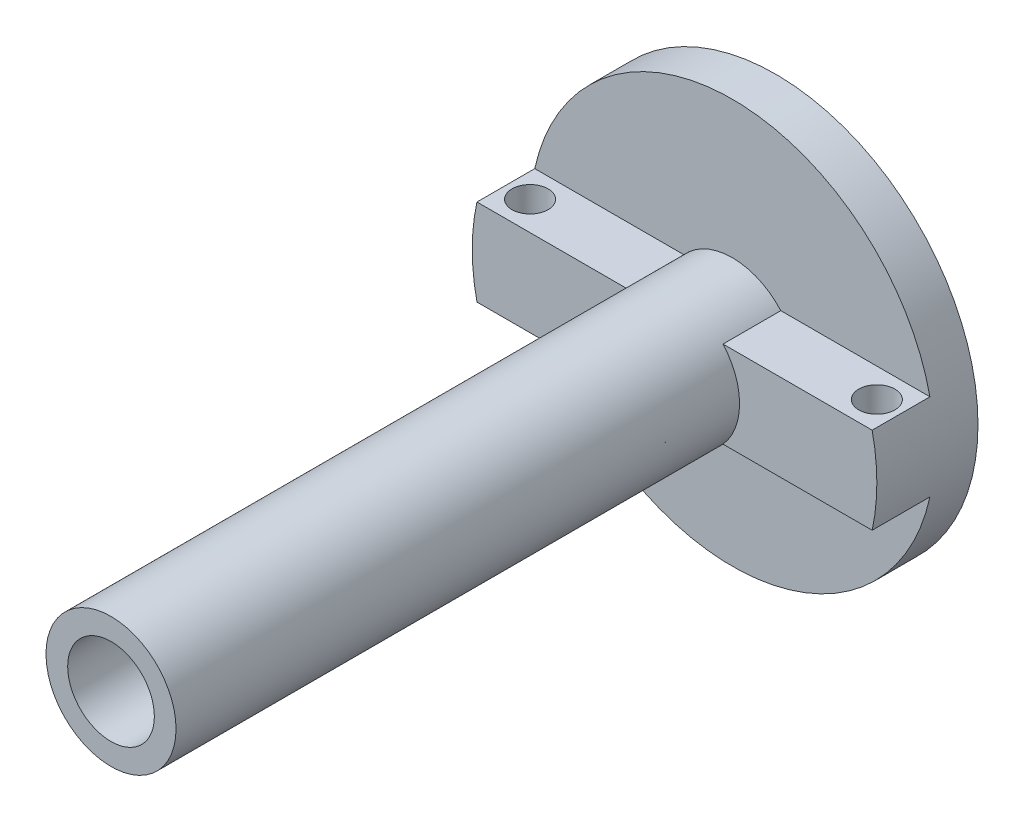
ISO-10303-21;
HEADER;
FILE_DESCRIPTION(('STEP AP214'),'2;1');
FILE_NAME('part.step','',(''),(''),'','','');
FILE_SCHEMA(('AUTOMOTIVE_DESIGN { 1 0 10303 214 1 1 1 1 }'));
ENDSEC;
DATA;
#1=APPLICATION_CONTEXT('core data for automotive mechanical design processes');
#2=APPLICATION_PROTOCOL_DEFINITION('international standard','automotive_design',2000,#1);
#3=PRODUCT_CONTEXT('',#1,'mechanical');
#4=PRODUCT('Part','Part','',(#3));
#5=PRODUCT_RELATED_PRODUCT_CATEGORY('part','',(#4));
#6=PRODUCT_DEFINITION_FORMATION('','',#4);
#7=PRODUCT_DEFINITION_CONTEXT('part definition',#1,'design');
#8=PRODUCT_DEFINITION('design','',#6,#7);
#9=PRODUCT_DEFINITION_SHAPE('','',#8);
#10=(LENGTH_UNIT() NAMED_UNIT(*) SI_UNIT(.MILLI.,.METRE.));
#11=(NAMED_UNIT(*) PLANE_ANGLE_UNIT() SI_UNIT($,.RADIAN.));
#12=(NAMED_UNIT(*) SI_UNIT($,.STERADIAN.) SOLID_ANGLE_UNIT());
#13=UNCERTAINTY_MEASURE_WITH_UNIT(LENGTH_MEASURE(1.E-05),#10,'distance_accuracy_value','');
#14=(GEOMETRIC_REPRESENTATION_CONTEXT(3) GLOBAL_UNCERTAINTY_ASSIGNED_CONTEXT((#13)) GLOBAL_UNIT_ASSIGNED_CONTEXT((#10,
#11,#12)) REPRESENTATION_CONTEXT('',''));
#15=CARTESIAN_POINT('',(0.,0.,0.));
#16=DIRECTION('',(0.,0.,1.));
#17=DIRECTION('',(1.,0.,0.));
#18=AXIS2_PLACEMENT_3D('',#15,#16,#17);
#19=CARTESIAN_POINT('',(0.,0.,1.5));
#20=DIRECTION('',(0.,0.,1.));
#21=DIRECTION('',(1.,0.,0.));
#22=AXIS2_PLACEMENT_3D('',#19,#20,#21);
#23=PLANE('',#22);
#24=CARTESIAN_POINT('',(0.,0.,1.5));
#25=DIRECTION('',(0.,0.,1.));
#26=DIRECTION('',(1.,0.,0.));
#27=AXIS2_PLACEMENT_3D('',#24,#25,#26);
#28=CIRCLE('',#27,7.);
#29=CARTESIAN_POINT('',(-6.83739716558867,-1.5,1.5));
#30=VERTEX_POINT('',#29);
#31=CARTESIAN_POINT('',(6.83739716558867,-1.5,1.5));
#32=VERTEX_POINT('',#31);
#33=EDGE_CURVE('E126',#30,#32,#28,.T.);
#34=ORIENTED_EDGE('',*,*,#33,.T.);
#35=DIRECTION('',(1.,0.,0.));
#36=VECTOR('',#35,1.);
#37=CARTESIAN_POINT('',(6.83739716558867,-1.5,1.5));
#38=LINE('',#37,#36);
#39=CARTESIAN_POINT('',(1.67705098312484,-1.5,1.5));
#40=VERTEX_POINT('',#39);
#41=EDGE_CURVE('E217',#40,#32,#38,.T.);
#42=ORIENTED_EDGE('',*,*,#41,.F.);
#43=CARTESIAN_POINT('',(0.,0.,1.5));
#44=DIRECTION('',(0.,0.,1.));
#45=DIRECTION('',(1.,0.,0.));
#46=AXIS2_PLACEMENT_3D('',#43,#44,#45);
#47=CIRCLE('',#46,2.25);
#48=CARTESIAN_POINT('',(-1.67705098312484,-1.5,1.5));
#49=VERTEX_POINT('',#48);
#50=EDGE_CURVE('E45',#49,#40,#47,.T.);
#51=ORIENTED_EDGE('',*,*,#50,.F.);
#52=EDGE_CURVE('E219',#30,#49,#38,.T.);
#53=ORIENTED_EDGE('',*,*,#52,.F.);
#54=EDGE_LOOP('',(#34,#42,#51,#53));
#55=FACE_BOUND('',#54,.T.);
#56=ADVANCED_FACE('F36',(#55),#23,.T.);
#57=CARTESIAN_POINT('',(6.83739716558867,1.5,1.5));
#58=VERTEX_POINT('',#57);
#59=CARTESIAN_POINT('',(-6.83739716558867,1.5,1.5));
#60=VERTEX_POINT('',#59);
#61=EDGE_CURVE('E152',#58,#60,#28,.T.);
#62=ORIENTED_EDGE('',*,*,#61,.T.);
#63=DIRECTION('',(-1.,0.,0.));
#64=VECTOR('',#63,1.);
#65=CARTESIAN_POINT('',(6.83739716558867,1.5,1.5));
#66=LINE('',#65,#64);
#67=CARTESIAN_POINT('',(-1.67705098312484,1.5,1.5));
#68=VERTEX_POINT('',#67);
#69=EDGE_CURVE('E232',#68,#60,#66,.T.);
#70=ORIENTED_EDGE('',*,*,#69,.F.);
#71=CARTESIAN_POINT('',(1.67705098312484,1.5,1.5));
#72=VERTEX_POINT('',#71);
#73=EDGE_CURVE('E11',#72,#68,#47,.T.);
#74=ORIENTED_EDGE('',*,*,#73,.F.);
#75=EDGE_CURVE('E119',#58,#72,#66,.T.);
#76=ORIENTED_EDGE('',*,*,#75,.F.);
#77=EDGE_LOOP('',(#62,#70,#74,#76));
#78=FACE_BOUND('',#77,.T.);
#79=ADVANCED_FACE('F178',(#78),#23,.T.);
#80=CARTESIAN_POINT('',(0.,0.,23.));
#81=DIRECTION('',(0.,0.,-1.));
#82=DIRECTION('',(-1.,0.,0.));
#83=AXIS2_PLACEMENT_3D('',#80,#81,#82);
#84=CYLINDRICAL_SURFACE('',#83,2.25);
#85=CARTESIAN_POINT('',(0.,0.,23.));
#86=DIRECTION('',(0.,0.,1.));
#87=DIRECTION('',(1.,0.,0.));
#88=AXIS2_PLACEMENT_3D('',#85,#86,#87);
#89=CIRCLE('',#88,2.25);
#90=CARTESIAN_POINT('',(2.25,0.,23.));
#91=VERTEX_POINT('',#90);
#92=EDGE_CURVE('E148',#91,#91,#89,.T.);
#93=ORIENTED_EDGE('',*,*,#92,.F.);
#94=EDGE_LOOP('',(#93));
#95=FACE_BOUND('',#94,.T.);
#96=DIRECTION('',(0.,0.,-1.));
#97=VECTOR('',#96,1.);
#98=CARTESIAN_POINT('',(-1.67705098312484,-1.5,23.));
#99=LINE('',#98,#97);
#100=CARTESIAN_POINT('',(-1.67705098312484,-1.5,3.5));
#101=VERTEX_POINT('',#100);
#102=EDGE_CURVE('E106',#49,#101,#99,.F.);
#103=ORIENTED_EDGE('',*,*,#102,.F.);
#104=ORIENTED_EDGE('',*,*,#50,.T.);
#105=DIRECTION('',(0.,0.,-1.));
#106=VECTOR('',#105,1.);
#107=CARTESIAN_POINT('',(1.67705098312484,-1.5,23.));
#108=LINE('',#107,#106);
#109=CARTESIAN_POINT('',(1.67705098312484,-1.5,3.5));
#110=VERTEX_POINT('',#109);
#111=EDGE_CURVE('E142',#110,#40,#108,.T.);
#112=ORIENTED_EDGE('',*,*,#111,.F.);
#113=CARTESIAN_POINT('',(0.,0.,3.5));
#114=DIRECTION('',(0.,0.,1.));
#115=DIRECTION('',(1.,0.,0.));
#116=AXIS2_PLACEMENT_3D('',#113,#114,#115);
#117=CIRCLE('',#116,2.25);
#118=CARTESIAN_POINT('',(1.67705098312484,1.5,3.5));
#119=VERTEX_POINT('',#118);
#120=EDGE_CURVE('E127',#110,#119,#117,.T.);
#121=ORIENTED_EDGE('',*,*,#120,.T.);
#122=DIRECTION('',(0.,0.,-1.));
#123=VECTOR('',#122,1.);
#124=CARTESIAN_POINT('',(1.67705098312484,1.5,23.));
#125=LINE('',#124,#123);
#126=EDGE_CURVE('E137',#72,#119,#125,.F.);
#127=ORIENTED_EDGE('',*,*,#126,.F.);
#128=ORIENTED_EDGE('',*,*,#73,.T.);
#129=DIRECTION('',(0.,0.,-1.));
#130=VECTOR('',#129,1.);
#131=CARTESIAN_POINT('',(-1.67705098312484,1.5,23.));
#132=LINE('',#131,#130);
#133=CARTESIAN_POINT('',(-1.67705098312484,1.5,3.5));
#134=VERTEX_POINT('',#133);
#135=EDGE_CURVE('E139',#134,#68,#132,.T.);
#136=ORIENTED_EDGE('',*,*,#135,.F.);
#137=EDGE_CURVE('E131',#134,#101,#117,.T.);
#138=ORIENTED_EDGE('',*,*,#137,.T.);
#139=EDGE_LOOP('',(#103,#104,#112,#121,#127,#128,#136,#138));
#140=FACE_BOUND('',#139,.T.);
#141=ADVANCED_FACE('F174',(#95,#140),#84,.T.);
#142=CARTESIAN_POINT('',(0.,0.,1.5));
#143=DIRECTION('',(0.,0.,-1.));
#144=DIRECTION('',(-1.,0.,0.));
#145=AXIS2_PLACEMENT_3D('',#142,#143,#144);
#146=CYLINDRICAL_SURFACE('',#145,7.);
#147=ORIENTED_EDGE('',*,*,#61,.F.);
#148=DIRECTION('',(0.,0.,-1.));
#149=VECTOR('',#148,1.);
#150=CARTESIAN_POINT('',(6.83739716558867,1.5,3.5));
#151=LINE('',#150,#149);
#152=CARTESIAN_POINT('',(6.83739716558867,1.5,3.5));
#153=VERTEX_POINT('',#152);
#154=EDGE_CURVE('E133',#153,#58,#151,.T.);
#155=ORIENTED_EDGE('',*,*,#154,.F.);
#156=CARTESIAN_POINT('',(0.,0.,3.5));
#157=DIRECTION('',(0.,0.,1.));
#158=DIRECTION('',(1.,0.,0.));
#159=AXIS2_PLACEMENT_3D('',#156,#157,#158);
#160=CIRCLE('',#159,7.);
#161=CARTESIAN_POINT('',(6.83739716558867,-1.5,3.5));
#162=VERTEX_POINT('',#161);
#163=EDGE_CURVE('E108',#162,#153,#160,.T.);
#164=ORIENTED_EDGE('',*,*,#163,.F.);
#165=DIRECTION('',(0.,0.,-1.));
#166=VECTOR('',#165,1.);
#167=CARTESIAN_POINT('',(6.83739716558867,-1.5,3.5));
#168=LINE('',#167,#166);
#169=EDGE_CURVE('E128',#162,#32,#168,.T.);
#170=ORIENTED_EDGE('',*,*,#169,.T.);
#171=ORIENTED_EDGE('',*,*,#33,.F.);
#172=DIRECTION('',(0.,0.,-1.));
#173=VECTOR('',#172,1.);
#174=CARTESIAN_POINT('',(-6.83739716558867,-1.5,3.5));
#175=LINE('',#174,#173);
#176=CARTESIAN_POINT('',(-6.83739716558867,-1.5,3.5));
#177=VERTEX_POINT('',#176);
#178=EDGE_CURVE('E103',#177,#30,#175,.T.);
#179=ORIENTED_EDGE('',*,*,#178,.F.);
#180=CARTESIAN_POINT('',(0.,0.,3.5));
#181=DIRECTION('',(0.,0.,1.));
#182=DIRECTION('',(1.,0.,0.));
#183=AXIS2_PLACEMENT_3D('',#180,#181,#182);
#184=CIRCLE('',#183,7.);
#185=CARTESIAN_POINT('',(-6.83739716558867,1.5,3.5));
#186=VERTEX_POINT('',#185);
#187=EDGE_CURVE('E112',#186,#177,#184,.T.);
#188=ORIENTED_EDGE('',*,*,#187,.F.);
#189=DIRECTION('',(0.,0.,-1.));
#190=VECTOR('',#189,1.);
#191=CARTESIAN_POINT('',(-6.83739716558867,1.5,3.5));
#192=LINE('',#191,#190);
#193=EDGE_CURVE('E230',#186,#60,#192,.T.);
#194=ORIENTED_EDGE('',*,*,#193,.T.);
#195=EDGE_LOOP('',(#147,#155,#164,#170,#171,#179,#188,#194));
#196=FACE_BOUND('',#195,.T.);
#197=CARTESIAN_POINT('',(0.,0.,0.));
#198=DIRECTION('',(0.,0.,1.));
#199=DIRECTION('',(1.,0.,0.));
#200=AXIS2_PLACEMENT_3D('',#197,#198,#199);
#201=CIRCLE('',#200,7.);
#202=CARTESIAN_POINT('',(7.,0.,0.));
#203=VERTEX_POINT('',#202);
#204=EDGE_CURVE('E40',#203,#203,#201,.T.);
#205=ORIENTED_EDGE('',*,*,#204,.T.);
#206=EDGE_LOOP('',(#205));
#207=FACE_BOUND('',#206,.T.);
#208=ADVANCED_FACE('F38',(#196,#207),#146,.T.);
#209=CARTESIAN_POINT('',(0.,0.,0.));
#210=DIRECTION('',(0.,0.,1.));
#211=DIRECTION('',(1.,0.,0.));
#212=AXIS2_PLACEMENT_3D('',#209,#210,#211);
#213=PLANE('',#212);
#214=CARTESIAN_POINT('',(0.,0.,0.));
#215=DIRECTION('',(0.,0.,-1.));
#216=DIRECTION('',(-1.,0.,0.));
#217=AXIS2_PLACEMENT_3D('',#214,#215,#216);
#218=CIRCLE('',#217,1.5);
#219=CARTESIAN_POINT('',(-1.5,0.,0.));
#220=VERTEX_POINT('',#219);
#221=EDGE_CURVE('E145',#220,#220,#218,.T.);
#222=ORIENTED_EDGE('',*,*,#221,.F.);
#223=EDGE_LOOP('',(#222));
#224=FACE_BOUND('',#223,.T.);
#225=ORIENTED_EDGE('',*,*,#204,.F.);
#226=EDGE_LOOP('',(#225));
#227=FACE_BOUND('',#226,.T.);
#228=ADVANCED_FACE('F163',(#224,#227),#213,.F.);
#229=CARTESIAN_POINT('',(0.,0.,23.));
#230=DIRECTION('',(0.,0.,1.));
#231=DIRECTION('',(1.,0.,0.));
#232=AXIS2_PLACEMENT_3D('',#229,#230,#231);
#233=PLANE('',#232);
#234=CARTESIAN_POINT('',(0.,0.,23.));
#235=DIRECTION('',(0.,0.,1.));
#236=DIRECTION('',(1.,0.,0.));
#237=AXIS2_PLACEMENT_3D('',#234,#235,#236);
#238=CIRCLE('',#237,1.5);
#239=CARTESIAN_POINT('',(1.5,0.,23.));
#240=VERTEX_POINT('',#239);
#241=EDGE_CURVE('E144',#240,#240,#238,.F.);
#242=ORIENTED_EDGE('',*,*,#241,.T.);
#243=EDGE_LOOP('',(#242));
#244=FACE_BOUND('',#243,.T.);
#245=ORIENTED_EDGE('',*,*,#92,.T.);
#246=EDGE_LOOP('',(#245));
#247=FACE_BOUND('',#246,.T.);
#248=ADVANCED_FACE('F165',(#244,#247),#233,.T.);
#249=CARTESIAN_POINT('',(0.,0.,23.001));
#250=DIRECTION('',(0.,0.,-1.));
#251=DIRECTION('',(-1.,0.,0.));
#252=AXIS2_PLACEMENT_3D('',#249,#250,#251);
#253=CYLINDRICAL_SURFACE('',#252,1.5);
#254=ORIENTED_EDGE('',*,*,#241,.F.);
#255=EDGE_LOOP('',(#254));
#256=FACE_BOUND('',#255,.T.);
#257=ORIENTED_EDGE('',*,*,#221,.T.);
#258=EDGE_LOOP('',(#257));
#259=FACE_BOUND('',#258,.T.);
#260=ADVANCED_FACE('F171',(#256,#259),#253,.F.);
#261=CARTESIAN_POINT('',(0.,0.,3.5));
#262=DIRECTION('',(0.,0.,1.));
#263=DIRECTION('',(1.,0.,0.));
#264=AXIS2_PLACEMENT_3D('',#261,#262,#263);
#265=PLANE('',#264);
#266=ORIENTED_EDGE('',*,*,#120,.F.);
#267=DIRECTION('',(1.,0.,0.));
#268=VECTOR('',#267,1.);
#269=CARTESIAN_POINT('',(6.83739716558867,-1.5,3.5));
#270=LINE('',#269,#268);
#271=EDGE_CURVE('E109',#110,#162,#270,.T.);
#272=ORIENTED_EDGE('',*,*,#271,.T.);
#273=ORIENTED_EDGE('',*,*,#163,.T.);
#274=DIRECTION('',(-1.,0.,0.));
#275=VECTOR('',#274,1.);
#276=CARTESIAN_POINT('',(6.83739716558867,1.5,3.5));
#277=LINE('',#276,#275);
#278=EDGE_CURVE('E61',#153,#119,#277,.T.);
#279=ORIENTED_EDGE('',*,*,#278,.T.);
#280=EDGE_LOOP('',(#266,#272,#273,#279));
#281=FACE_BOUND('',#280,.T.);
#282=ADVANCED_FACE('F188',(#281),#265,.T.);
#283=CARTESIAN_POINT('',(6.83739716558867,1.5,3.5));
#284=DIRECTION('',(0.,-1.,0.));
#285=DIRECTION('',(0.,0.,-1.));
#286=AXIS2_PLACEMENT_3D('',#283,#284,#285);
#287=PLANE('',#286);
#288=CARTESIAN_POINT('',(6.,1.5,2.5));
#289=DIRECTION('',(0.,-1.,0.));
#290=DIRECTION('',(0.,0.,-1.));
#291=AXIS2_PLACEMENT_3D('',#288,#289,#290);
#292=CIRCLE('',#291,0.625);
#293=CARTESIAN_POINT('',(6.,1.5,1.875));
#294=VERTEX_POINT('',#293);
#295=EDGE_CURVE('E224',#294,#294,#292,.F.);
#296=ORIENTED_EDGE('',*,*,#295,.F.);
#297=EDGE_LOOP('',(#296));
#298=FACE_BOUND('',#297,.T.);
#299=ORIENTED_EDGE('',*,*,#75,.T.);
#300=ORIENTED_EDGE('',*,*,#126,.T.);
#301=ORIENTED_EDGE('',*,*,#278,.F.);
#302=ORIENTED_EDGE('',*,*,#154,.T.);
#303=EDGE_LOOP('',(#299,#300,#301,#302));
#304=FACE_BOUND('',#303,.T.);
#305=ADVANCED_FACE('F193',(#298,#304),#287,.F.);
#306=CARTESIAN_POINT('',(6.83739716558867,-1.5,3.5));
#307=DIRECTION('',(0.,1.,0.));
#308=DIRECTION('',(0.,0.,1.));
#309=AXIS2_PLACEMENT_3D('',#306,#307,#308);
#310=PLANE('',#309);
#311=CARTESIAN_POINT('',(6.,-1.5,2.5));
#312=DIRECTION('',(0.,-1.,0.));
#313=DIRECTION('',(-1.,0.,0.));
#314=AXIS2_PLACEMENT_3D('',#311,#312,#313);
#315=CIRCLE('',#314,0.625);
#316=CARTESIAN_POINT('',(5.375,-1.5,2.5));
#317=VERTEX_POINT('',#316);
#318=EDGE_CURVE('E221',#317,#317,#315,.T.);
#319=ORIENTED_EDGE('',*,*,#318,.F.);
#320=EDGE_LOOP('',(#319));
#321=FACE_BOUND('',#320,.T.);
#322=ORIENTED_EDGE('',*,*,#271,.F.);
#323=ORIENTED_EDGE('',*,*,#111,.T.);
#324=ORIENTED_EDGE('',*,*,#41,.T.);
#325=ORIENTED_EDGE('',*,*,#169,.F.);
#326=EDGE_LOOP('',(#322,#323,#324,#325));
#327=FACE_BOUND('',#326,.T.);
#328=ADVANCED_FACE('F190',(#321,#327),#310,.F.);
#329=CARTESIAN_POINT('',(-6.,-1.5,2.5));
#330=DIRECTION('',(0.,-1.,0.));
#331=DIRECTION('',(1.,0.,0.));
#332=AXIS2_PLACEMENT_3D('',#329,#330,#331);
#333=CIRCLE('',#332,0.625);
#334=CARTESIAN_POINT('',(-5.375,-1.5,2.5));
#335=VERTEX_POINT('',#334);
#336=EDGE_CURVE('E213',#335,#335,#333,.T.);
#337=ORIENTED_EDGE('',*,*,#336,.F.);
#338=EDGE_LOOP('',(#337));
#339=FACE_BOUND('',#338,.T.);
#340=ORIENTED_EDGE('',*,*,#52,.T.);
#341=ORIENTED_EDGE('',*,*,#102,.T.);
#342=EDGE_CURVE('E53',#177,#101,#270,.T.);
#343=ORIENTED_EDGE('',*,*,#342,.F.);
#344=ORIENTED_EDGE('',*,*,#178,.T.);
#345=EDGE_LOOP('',(#340,#341,#343,#344));
#346=FACE_BOUND('',#345,.T.);
#347=ADVANCED_FACE('F101',(#339,#346),#310,.F.);
#348=CARTESIAN_POINT('',(-6.,1.5,2.5));
#349=DIRECTION('',(0.,-1.,0.));
#350=DIRECTION('',(0.,0.,-1.));
#351=AXIS2_PLACEMENT_3D('',#348,#349,#350);
#352=CIRCLE('',#351,0.625);
#353=CARTESIAN_POINT('',(-6.,1.5,1.875));
#354=VERTEX_POINT('',#353);
#355=EDGE_CURVE('E216',#354,#354,#352,.F.);
#356=ORIENTED_EDGE('',*,*,#355,.F.);
#357=EDGE_LOOP('',(#356));
#358=FACE_BOUND('',#357,.T.);
#359=EDGE_CURVE('E115',#134,#186,#277,.T.);
#360=ORIENTED_EDGE('',*,*,#359,.F.);
#361=ORIENTED_EDGE('',*,*,#135,.T.);
#362=ORIENTED_EDGE('',*,*,#69,.T.);
#363=ORIENTED_EDGE('',*,*,#193,.F.);
#364=EDGE_LOOP('',(#360,#361,#362,#363));
#365=FACE_BOUND('',#364,.T.);
#366=ADVANCED_FACE('F195',(#358,#365),#287,.F.);
#367=ORIENTED_EDGE('',*,*,#137,.F.);
#368=ORIENTED_EDGE('',*,*,#359,.T.);
#369=ORIENTED_EDGE('',*,*,#187,.T.);
#370=ORIENTED_EDGE('',*,*,#342,.T.);
#371=EDGE_LOOP('',(#367,#368,#369,#370));
#372=FACE_BOUND('',#371,.T.);
#373=ADVANCED_FACE('F113',(#372),#265,.T.);
#374=CARTESIAN_POINT('',(-6.,7.001,2.5));
#375=DIRECTION('',(0.,-1.,0.));
#376=DIRECTION('',(1.,0.,0.));
#377=AXIS2_PLACEMENT_3D('',#374,#375,#376);
#378=CYLINDRICAL_SURFACE('',#377,0.625);
#379=ORIENTED_EDGE('',*,*,#336,.T.);
#380=EDGE_LOOP('',(#379));
#381=FACE_BOUND('',#380,.T.);
#382=ORIENTED_EDGE('',*,*,#355,.T.);
#383=EDGE_LOOP('',(#382));
#384=FACE_BOUND('',#383,.T.);
#385=ADVANCED_FACE('F201',(#381,#384),#378,.F.);
#386=CARTESIAN_POINT('',(6.,7.001,2.5));
#387=DIRECTION('',(0.,-1.,0.));
#388=DIRECTION('',(1.,0.,0.));
#389=AXIS2_PLACEMENT_3D('',#386,#387,#388);
#390=CYLINDRICAL_SURFACE('',#389,0.625);
#391=ORIENTED_EDGE('',*,*,#318,.T.);
#392=EDGE_LOOP('',(#391));
#393=FACE_BOUND('',#392,.T.);
#394=ORIENTED_EDGE('',*,*,#295,.T.);
#395=EDGE_LOOP('',(#394));
#396=FACE_BOUND('',#395,.T.);
#397=ADVANCED_FACE('F202',(#393,#396),#390,.F.);
#398=CLOSED_SHELL('',(#56,#79,#141,#208,#228,#248,#260,#282,#305,#328,#347,#366,#373,#385,#397));
#399=MANIFOLD_SOLID_BREP('B2',#398);
#400=ADVANCED_BREP_SHAPE_REPRESENTATION('',(#18,#399),#14);
#401=SHAPE_DEFINITION_REPRESENTATION(#9,#400);
ENDSEC;
END-ISO-10303-21;
